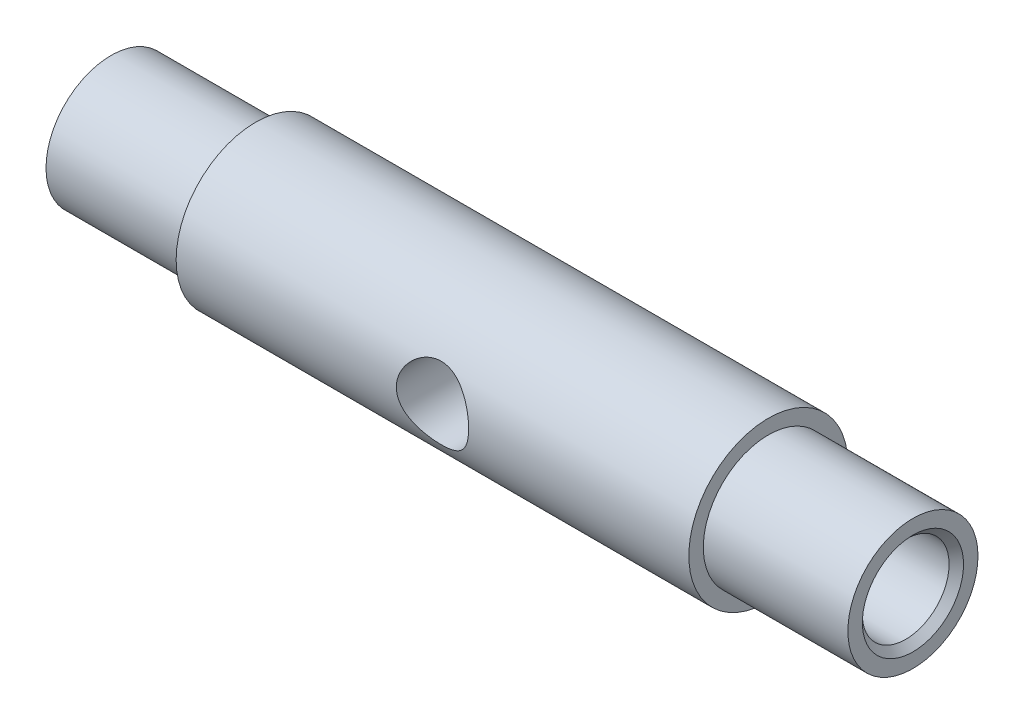
ISO-10303-21;
HEADER;
FILE_DESCRIPTION(('STEP AP214'),'2;1');
FILE_NAME('part.step','',(''),(''),'','','');
FILE_SCHEMA(('AUTOMOTIVE_DESIGN { 1 0 10303 214 1 1 1 1 }'));
ENDSEC;
DATA;
#1=APPLICATION_CONTEXT('core data for automotive mechanical design processes');
#2=APPLICATION_PROTOCOL_DEFINITION('international standard','automotive_design',2000,#1);
#3=PRODUCT_CONTEXT('',#1,'mechanical');
#4=PRODUCT('Part','Part','',(#3));
#5=PRODUCT_RELATED_PRODUCT_CATEGORY('part','',(#4));
#6=PRODUCT_DEFINITION_FORMATION('','',#4);
#7=PRODUCT_DEFINITION_CONTEXT('part definition',#1,'design');
#8=PRODUCT_DEFINITION('design','',#6,#7);
#9=PRODUCT_DEFINITION_SHAPE('','',#8);
#10=(LENGTH_UNIT() NAMED_UNIT(*) SI_UNIT(.MILLI.,.METRE.));
#11=(NAMED_UNIT(*) PLANE_ANGLE_UNIT() SI_UNIT($,.RADIAN.));
#12=(NAMED_UNIT(*) SI_UNIT($,.STERADIAN.) SOLID_ANGLE_UNIT());
#13=UNCERTAINTY_MEASURE_WITH_UNIT(LENGTH_MEASURE(1.E-05),#10,'distance_accuracy_value','');
#14=(GEOMETRIC_REPRESENTATION_CONTEXT(3) GLOBAL_UNCERTAINTY_ASSIGNED_CONTEXT((#13)) GLOBAL_UNIT_ASSIGNED_CONTEXT((#10,
#11,#12)) REPRESENTATION_CONTEXT('',''));
#15=CARTESIAN_POINT('',(0.,0.,0.));
#16=DIRECTION('',(0.,0.,1.));
#17=DIRECTION('',(1.,0.,0.));
#18=AXIS2_PLACEMENT_3D('',#15,#16,#17);
#19=CARTESIAN_POINT('',(-13.865,0.,0.));
#20=DIRECTION('',(1.,0.,0.));
#21=DIRECTION('',(0.,0.,-1.));
#22=AXIS2_PLACEMENT_3D('',#19,#20,#21);
#23=CYLINDRICAL_SURFACE('',#22,2.75);
#24=CARTESIAN_POINT('',(-1.25,0.,2.75));
#25=CARTESIAN_POINT('',(-1.24999664423867,-0.066409297201123,2.74999722006381));
#26=CARTESIAN_POINT('',(-1.24467658918359,-0.132918179160474,2.74756773000003));
#27=CARTESIAN_POINT('',(-1.22361132332389,-0.264013618832331,2.73809041057661));
#28=CARTESIAN_POINT('',(-1.20784192650701,-0.328595352707354,2.73103186721671));
#29=CARTESIAN_POINT('',(-1.16659731207724,-0.453733457531664,2.71304396647087));
#30=CARTESIAN_POINT('',(-1.1411573277518,-0.514303514696179,2.70212867062397));
#31=CARTESIAN_POINT('',(-1.08145528075543,-0.63024582495532,2.67746302459246));
#32=CARTESIAN_POINT('',(-1.04719498708065,-0.68561911727493,2.66371324300075));
#33=CARTESIAN_POINT('',(-0.968757040396112,-0.792876404622121,2.63383894536601));
#34=CARTESIAN_POINT('',(-0.924152661937973,-0.844423861031633,2.61762758087896));
#35=CARTESIAN_POINT('',(-0.827200544196096,-0.939605833782935,2.58499080357135));
#36=CARTESIAN_POINT('',(-0.774848012192131,-0.983235414967038,2.56856526404589));
#37=CARTESIAN_POINT('',(-0.660027529152778,-1.0639942192231,2.53622246241453));
#38=CARTESIAN_POINT('',(-0.597137096532528,-1.10056379760175,2.52039748982969));
#39=CARTESIAN_POINT('',(-0.465283990348065,-1.16245662732703,2.49245983364399));
#40=CARTESIAN_POINT('',(-0.396325044113193,-1.1877867250721,2.48034489151889));
#41=CARTESIAN_POINT('',(-0.258152257197776,-1.22502813882896,2.46215702137186));
#42=CARTESIAN_POINT('',(-0.189154209636334,-1.23759151471749,2.45579257210869));
#43=CARTESIAN_POINT('',(-0.0497590272881938,-1.25096639629459,2.44900910731335));
#44=CARTESIAN_POINT('',(0.0206370690327838,-1.25178632043297,2.4485858327753));
#45=CARTESIAN_POINT('',(0.153705360130787,-1.24213570599715,2.45349076513661));
#46=CARTESIAN_POINT('',(0.216478664779185,-1.23272508141617,2.45827909061313));
#47=CARTESIAN_POINT('',(0.339433038254887,-1.20468382543912,2.47214054978987));
#48=CARTESIAN_POINT('',(0.399613484659595,-1.18605099348516,2.48121470613037));
#49=CARTESIAN_POINT('',(0.51731828994404,-1.13972592389796,2.502836041094));
#50=CARTESIAN_POINT('',(0.57475099300539,-1.11183710259723,2.51545758142744));
#51=CARTESIAN_POINT('',(0.684370727634119,-1.0479342963697,2.5427424445358));
#52=CARTESIAN_POINT('',(0.736555495087547,-1.01191682605958,2.55740664212108));
#53=CARTESIAN_POINT('',(0.839823282611981,-0.928462390288526,2.58894610793606));
#54=CARTESIAN_POINT('',(0.890246366767324,-0.880233766499683,2.6058940299158));
#55=CARTESIAN_POINT('',(0.982534136643408,-0.775874076245868,2.63884684198751));
#56=CARTESIAN_POINT('',(1.02439599619325,-0.719740410517154,2.65485141943222));
#57=CARTESIAN_POINT('',(1.09960334197981,-0.598831409627828,2.68475267309383));
#58=CARTESIAN_POINT('',(1.13263123951186,-0.533836033425862,2.69856489262048));
#59=CARTESIAN_POINT('',(1.18704419793949,-0.398422448040728,2.72184968026242));
#60=CARTESIAN_POINT('',(1.2084369380899,-0.328007850689103,2.73132511002178));
#61=CARTESIAN_POINT('',(1.23747768468173,-0.189224957177744,2.74430245200301));
#62=CARTESIAN_POINT('',(1.24600819960431,-0.121077242101445,2.74818697383875));
#63=CARTESIAN_POINT('',(1.25177344223046,0.0157830218141219,2.75080503667139));
#64=CARTESIAN_POINT('',(1.24901224677108,0.0844953578580984,2.74954043674346));
#65=CARTESIAN_POINT('',(1.23285709547855,0.216073389246547,2.74224203969368));
#66=CARTESIAN_POINT('',(1.22012623923028,0.279039063698162,2.73650576628531));
#67=CARTESIAN_POINT('',(1.18536633693719,0.401846731740723,2.72118555280463));
#68=CARTESIAN_POINT('',(1.16333617942209,0.461688350977593,2.71160115280357));
#69=CARTESIAN_POINT('',(1.10991512595896,0.578663737582029,2.68910907975177));
#70=CARTESIAN_POINT('',(1.07825503256185,0.635655904758833,2.67610753251244));
#71=CARTESIAN_POINT('',(1.00676622266693,0.743723074643527,2.64811200049283));
#72=CARTESIAN_POINT('',(0.966933924043203,0.794795467118611,2.6331171430023));
#73=CARTESIAN_POINT('',(0.876344673437788,0.894095643067372,2.60116069331972));
#74=CARTESIAN_POINT('',(0.824951554626256,0.94172531826107,2.58413964097087));
#75=CARTESIAN_POINT('',(0.714718816878852,1.02789777986372,2.55109013589481));
#76=CARTESIAN_POINT('',(0.655876173523583,1.06643685729908,2.53506209027515));
#77=CARTESIAN_POINT('',(0.530272915587283,1.13425708875271,2.5054683792703));
#78=CARTESIAN_POINT('',(0.463339627914695,1.16325589057755,2.49198214330476));
#79=CARTESIAN_POINT('',(0.324725293272233,1.20928572229315,2.46997777901049));
#80=CARTESIAN_POINT('',(0.253049252960886,1.22632915900213,2.46145450187975));
#81=CARTESIAN_POINT('',(0.113718690216077,1.2466290380409,2.45123100377802));
#82=CARTESIAN_POINT('',(0.0462595388900316,1.25095942837577,2.44899997173237));
#83=CARTESIAN_POINT('',(-0.0884165459261601,1.24868510401172,2.45016089632338));
#84=CARTESIAN_POINT('',(-0.155633533948322,1.24208302836414,2.45355149592204));
#85=CARTESIAN_POINT('',(-0.283313147404379,1.21908425290037,2.46505170930849));
#86=CARTESIAN_POINT('',(-0.343929306975639,1.20335999852459,2.47283643484033));
#87=CARTESIAN_POINT('',(-0.461646409538555,1.16329328542381,2.49193468099743));
#88=CARTESIAN_POINT('',(-0.518746317999274,1.13894830444563,2.50324923426469));
#89=CARTESIAN_POINT('',(-0.631893509980613,1.08052106704645,2.52904242136797));
#90=CARTESIAN_POINT('',(-0.68762952189941,1.04590750399576,2.54367923604935));
#91=CARTESIAN_POINT('',(-0.792834391307874,0.968596555260978,2.57411065746893));
#92=CARTESIAN_POINT('',(-0.842300468195849,0.925895603760462,2.58990577302476));
#93=CARTESIAN_POINT('',(-0.938329950721095,0.828924012690176,2.62263949427761));
#94=CARTESIAN_POINT('',(-0.984193118870729,0.773945978687972,2.6395474679947));
#95=CARTESIAN_POINT('',(-1.06613132879772,0.656497888375395,2.6711803863168));
#96=CARTESIAN_POINT('',(-1.10220183612246,0.594024380555975,2.68590431818336));
#97=CARTESIAN_POINT('',(-1.16300847719161,0.463719738066244,2.71142629318597));
#98=CARTESIAN_POINT('',(-1.1878416325161,0.395940632153449,2.72225776873055));
#99=CARTESIAN_POINT('',(-1.2254803936225,0.256651849448491,2.73888892791797));
#100=CARTESIAN_POINT('',(-1.23832229651404,0.185154127024114,2.7447037925775));
#101=CARTESIAN_POINT('',(-1.24658170071688,0.0943030237739493,2.74844792420964));
#102=CARTESIAN_POINT('',(-1.24786228311144,0.0754723356989378,2.74902888293267));
#103=CARTESIAN_POINT('',(-1.24957191648039,0.0377637835624768,2.74980531908613));
#104=CARTESIAN_POINT('',(-1.25000095433378,0.0188859187785947,2.75000079057679));
#105=CARTESIAN_POINT('',(-1.25,0.,2.75));
#106=B_SPLINE_CURVE_WITH_KNOTS('',3,(#24,#25,#26,#27,#28,#29,#30,#31,#32,#33,#34,#35,#36,#37,
#38,#39,#40,#41,#42,#43,#44,#45,#46,#47,#48,#49,#50,#51,#52,#53,#54,#55,#56,#57,#58,#59,#60,#61,
#62,#63,#64,#65,#66,#67,#68,#69,#70,#71,#72,#73,#74,#75,#76,#77,#78,#79,#80,#81,#82,#83,#84,#85,
#86,#87,#88,#89,#90,#91,#92,#93,#94,#95,#96,#97,#98,#99,#100,#101,#102,#103,#104,#105),
.UNSPECIFIED.,.T.,.F.,(4,2,2,2,2,2,2,2,2,2,2,2,2,2,2,2,2,2,2,2,2,2,2,2,2,2,2,2,2,2,2,2,2,2,2,2,
2,2,2,2,4),(0.,0.199150465500601,0.398763501700331,0.597656142874561,0.79650892528868,
1.00581702909932,1.21525514848388,1.43748275689135,1.65957481148718,1.86964669042411,
2.07956796899307,2.26964626889944,2.45976994623912,2.65422185099479,2.8487572913309,
3.06321184122665,3.27773707147317,3.49916919969502,3.72045500384428,3.92572957947018,
4.13093004789081,4.32353422798305,4.51616143501641,4.71476455610418,4.91345491768045,
5.12881429156235,5.34426138090047,5.56560701120833,5.78672259633828,5.98852995638714,
6.19028860808863,6.37878337463006,6.56733333662171,6.76817468068634,6.96910478488007,
7.18876214345762,7.40852104069106,7.62634457271381,7.84350660241823,7.90014146715376,
7.95677720453813),.UNSPECIFIED.);
#107=CARTESIAN_POINT('',(-1.25,0.,2.75));
#108=VERTEX_POINT('',#107);
#109=EDGE_CURVE('E87',#108,#108,#106,.T.);
#110=ORIENTED_EDGE('',*,*,#109,.F.);
#111=EDGE_LOOP('',(#110));
#112=FACE_BOUND('',#111,.T.);
#113=DIRECTION('',(1.,0.,0.));
#114=VECTOR('',#113,1.);
#115=CARTESIAN_POINT('',(-13.865,-1.44461067419565,-2.34));
#116=LINE('',#115,#114);
#117=CARTESIAN_POINT('',(3.7,-1.44461067419565,-2.34));
#118=VERTEX_POINT('',#117);
#119=CARTESIAN_POINT('',(-3.7,-1.44461067419565,-2.34));
#120=VERTEX_POINT('',#119);
#121=EDGE_CURVE('E11',#118,#120,#116,.F.);
#122=ORIENTED_EDGE('',*,*,#121,.F.);
#123=CARTESIAN_POINT('',(3.7,0.,0.));
#124=DIRECTION('',(-1.,0.,0.));
#125=DIRECTION('',(0.,0.,1.));
#126=AXIS2_PLACEMENT_3D('',#123,#124,#125);
#127=CIRCLE('',#126,2.75);
#128=CARTESIAN_POINT('',(3.7,1.44461067419565,-2.34));
#129=VERTEX_POINT('',#128);
#130=EDGE_CURVE('E53',#118,#129,#127,.F.);
#131=ORIENTED_EDGE('',*,*,#130,.T.);
#132=DIRECTION('',(1.,0.,0.));
#133=VECTOR('',#132,1.);
#134=CARTESIAN_POINT('',(-13.865,1.44461067419565,-2.34));
#135=LINE('',#134,#133);
#136=CARTESIAN_POINT('',(-3.7,1.44461067419565,-2.34));
#137=VERTEX_POINT('',#136);
#138=EDGE_CURVE('E88',#137,#129,#135,.T.);
#139=ORIENTED_EDGE('',*,*,#138,.F.);
#140=CARTESIAN_POINT('',(-3.7,0.,0.));
#141=DIRECTION('',(1.,0.,0.));
#142=DIRECTION('',(0.,0.,-1.));
#143=AXIS2_PLACEMENT_3D('',#140,#141,#142);
#144=CIRCLE('',#143,2.75);
#145=EDGE_CURVE('E81',#137,#120,#144,.F.);
#146=ORIENTED_EDGE('',*,*,#145,.T.);
#147=EDGE_LOOP('',(#122,#131,#139,#146));
#148=FACE_BOUND('',#147,.T.);
#149=CARTESIAN_POINT('',(8.865,0.,0.));
#150=DIRECTION('',(1.,0.,0.));
#151=DIRECTION('',(0.,0.,-1.));
#152=AXIS2_PLACEMENT_3D('',#149,#150,#151);
#153=CIRCLE('',#152,2.75);
#154=CARTESIAN_POINT('',(8.865,0.,-2.75));
#155=VERTEX_POINT('',#154);
#156=EDGE_CURVE('E98',#155,#155,#153,.T.);
#157=ORIENTED_EDGE('',*,*,#156,.F.);
#158=EDGE_LOOP('',(#157));
#159=FACE_BOUND('',#158,.T.);
#160=CARTESIAN_POINT('',(-8.865,0.,0.));
#161=DIRECTION('',(-1.,0.,0.));
#162=DIRECTION('',(0.,0.,1.));
#163=AXIS2_PLACEMENT_3D('',#160,#161,#162);
#164=CIRCLE('',#163,2.75);
#165=CARTESIAN_POINT('',(-8.865,0.,2.75));
#166=VERTEX_POINT('',#165);
#167=EDGE_CURVE('E110',#166,#166,#164,.T.);
#168=ORIENTED_EDGE('',*,*,#167,.F.);
#169=EDGE_LOOP('',(#168));
#170=FACE_BOUND('',#169,.T.);
#171=ADVANCED_FACE('F44',(#112,#148,#159,#170),#23,.T.);
#172=CARTESIAN_POINT('',(8.865,0.,0.));
#173=DIRECTION('',(1.,0.,0.));
#174=DIRECTION('',(0.,0.,-1.));
#175=AXIS2_PLACEMENT_3D('',#172,#173,#174);
#176=PLANE('',#175);
#177=CARTESIAN_POINT('',(8.865,0.,0.));
#178=DIRECTION('',(1.,0.,0.));
#179=DIRECTION('',(0.,0.,-1.));
#180=AXIS2_PLACEMENT_3D('',#177,#178,#179);
#181=CIRCLE('',#180,2.25);
#182=CARTESIAN_POINT('',(8.865,0.,-2.25));
#183=VERTEX_POINT('',#182);
#184=EDGE_CURVE('E105',#183,#183,#181,.T.);
#185=ORIENTED_EDGE('',*,*,#184,.F.);
#186=EDGE_LOOP('',(#185));
#187=FACE_BOUND('',#186,.T.);
#188=ORIENTED_EDGE('',*,*,#156,.T.);
#189=EDGE_LOOP('',(#188));
#190=FACE_BOUND('',#189,.T.);
#191=ADVANCED_FACE('F204',(#187,#190),#176,.T.);
#192=CARTESIAN_POINT('',(8.865,0.,0.));
#193=DIRECTION('',(1.,0.,0.));
#194=DIRECTION('',(0.,0.,-1.));
#195=AXIS2_PLACEMENT_3D('',#192,#193,#194);
#196=CYLINDRICAL_SURFACE('',#195,2.25);
#197=ORIENTED_EDGE('',*,*,#184,.T.);
#198=EDGE_LOOP('',(#197));
#199=FACE_BOUND('',#198,.T.);
#200=CARTESIAN_POINT('',(13.865,0.,0.));
#201=DIRECTION('',(1.,0.,0.));
#202=DIRECTION('',(0.,0.,-1.));
#203=AXIS2_PLACEMENT_3D('',#200,#201,#202);
#204=CIRCLE('',#203,2.25);
#205=CARTESIAN_POINT('',(13.865,0.,-2.25));
#206=VERTEX_POINT('',#205);
#207=EDGE_CURVE('E101',#206,#206,#204,.T.);
#208=ORIENTED_EDGE('',*,*,#207,.F.);
#209=EDGE_LOOP('',(#208));
#210=FACE_BOUND('',#209,.T.);
#211=ADVANCED_FACE('F205',(#199,#210),#196,.T.);
#212=CARTESIAN_POINT('',(13.865,0.,0.));
#213=DIRECTION('',(1.,0.,0.));
#214=DIRECTION('',(0.,0.,-1.));
#215=AXIS2_PLACEMENT_3D('',#212,#213,#214);
#216=PLANE('',#215);
#217=CARTESIAN_POINT('',(13.865,0.,0.));
#218=DIRECTION('',(1.,0.,0.));
#219=DIRECTION('',(0.,0.,-1.));
#220=AXIS2_PLACEMENT_3D('',#217,#218,#219);
#221=CIRCLE('',#220,1.75);
#222=CARTESIAN_POINT('',(13.865,0.,-1.75));
#223=VERTEX_POINT('',#222);
#224=EDGE_CURVE('E145',#223,#223,#221,.T.);
#225=ORIENTED_EDGE('',*,*,#224,.F.);
#226=EDGE_LOOP('',(#225));
#227=FACE_BOUND('',#226,.T.);
#228=ORIENTED_EDGE('',*,*,#207,.T.);
#229=EDGE_LOOP('',(#228));
#230=FACE_BOUND('',#229,.T.);
#231=ADVANCED_FACE('F196',(#227,#230),#216,.T.);
#232=CARTESIAN_POINT('',(-8.865,0.,0.));
#233=DIRECTION('',(-1.,0.,0.));
#234=DIRECTION('',(0.,0.,1.));
#235=AXIS2_PLACEMENT_3D('',#232,#233,#234);
#236=PLANE('',#235);
#237=CARTESIAN_POINT('',(-8.865,0.,0.));
#238=DIRECTION('',(-1.,0.,0.));
#239=DIRECTION('',(0.,0.,1.));
#240=AXIS2_PLACEMENT_3D('',#237,#238,#239);
#241=CIRCLE('',#240,2.25);
#242=CARTESIAN_POINT('',(-8.865,0.,2.25));
#243=VERTEX_POINT('',#242);
#244=EDGE_CURVE('E112',#243,#243,#241,.T.);
#245=ORIENTED_EDGE('',*,*,#244,.F.);
#246=EDGE_LOOP('',(#245));
#247=FACE_BOUND('',#246,.T.);
#248=ORIENTED_EDGE('',*,*,#167,.T.);
#249=EDGE_LOOP('',(#248));
#250=FACE_BOUND('',#249,.T.);
#251=ADVANCED_FACE('F198',(#247,#250),#236,.T.);
#252=CARTESIAN_POINT('',(-8.865,0.,0.));
#253=DIRECTION('',(-1.,0.,0.));
#254=DIRECTION('',(0.,0.,1.));
#255=AXIS2_PLACEMENT_3D('',#252,#253,#254);
#256=CYLINDRICAL_SURFACE('',#255,2.25);
#257=ORIENTED_EDGE('',*,*,#244,.T.);
#258=EDGE_LOOP('',(#257));
#259=FACE_BOUND('',#258,.T.);
#260=CARTESIAN_POINT('',(-13.865,0.,0.));
#261=DIRECTION('',(-1.,0.,0.));
#262=DIRECTION('',(0.,0.,1.));
#263=AXIS2_PLACEMENT_3D('',#260,#261,#262);
#264=CIRCLE('',#263,2.25);
#265=CARTESIAN_POINT('',(-13.865,0.,2.25));
#266=VERTEX_POINT('',#265);
#267=EDGE_CURVE('E114',#266,#266,#264,.T.);
#268=ORIENTED_EDGE('',*,*,#267,.F.);
#269=EDGE_LOOP('',(#268));
#270=FACE_BOUND('',#269,.T.);
#271=ADVANCED_FACE('F194',(#259,#270),#256,.T.);
#272=CARTESIAN_POINT('',(-13.865,0.,0.));
#273=DIRECTION('',(1.,0.,0.));
#274=DIRECTION('',(0.,0.,-1.));
#275=AXIS2_PLACEMENT_3D('',#272,#273,#274);
#276=PLANE('',#275);
#277=CARTESIAN_POINT('',(-13.865,0.,0.));
#278=DIRECTION('',(-1.,0.,0.));
#279=DIRECTION('',(0.,0.,1.));
#280=AXIS2_PLACEMENT_3D('',#277,#278,#279);
#281=CIRCLE('',#280,1.75);
#282=CARTESIAN_POINT('',(-13.865,0.,1.75));
#283=VERTEX_POINT('',#282);
#284=EDGE_CURVE('E128',#283,#283,#281,.T.);
#285=ORIENTED_EDGE('',*,*,#284,.F.);
#286=EDGE_LOOP('',(#285));
#287=FACE_BOUND('',#286,.T.);
#288=ORIENTED_EDGE('',*,*,#267,.T.);
#289=EDGE_LOOP('',(#288));
#290=FACE_BOUND('',#289,.T.);
#291=ADVANCED_FACE('F195',(#287,#290),#276,.F.);
#292=CARTESIAN_POINT('',(-3.86500000000001,0.,0.));
#293=DIRECTION('',(-1.,0.,0.));
#294=DIRECTION('',(0.,0.,1.));
#295=AXIS2_PLACEMENT_3D('',#292,#293,#294);
#296=CONICAL_SURFACE('',#295,1.49999999999999,1.02974425867665);
#297=CARTESIAN_POINT('',(-2.96370907145866,0.,0.));
#298=VERTEX_POINT('',#297);
#299=VERTEX_LOOP('',#298);
#300=FACE_BOUND('',#299,.T.);
#301=CARTESIAN_POINT('',(-3.86500000000001,0.,0.));
#302=DIRECTION('',(-1.,0.,0.));
#303=DIRECTION('',(0.,0.,1.));
#304=AXIS2_PLACEMENT_3D('',#301,#302,#303);
#305=CIRCLE('',#304,1.49999999999999);
#306=CARTESIAN_POINT('',(-3.86500000000001,0.,1.49999999999999));
#307=VERTEX_POINT('',#306);
#308=EDGE_CURVE('E118',#307,#307,#305,.T.);
#309=ORIENTED_EDGE('',*,*,#308,.T.);
#310=EDGE_LOOP('',(#309));
#311=FACE_BOUND('',#310,.T.);
#312=ADVANCED_FACE('F189',(#300,#311),#296,.F.);
#313=CARTESIAN_POINT('',(-13.865,0.,0.));
#314=DIRECTION('',(-1.,0.,0.));
#315=DIRECTION('',(0.,0.,1.));
#316=AXIS2_PLACEMENT_3D('',#313,#314,#315);
#317=CYLINDRICAL_SURFACE('',#316,1.49999999999999);
#318=ORIENTED_EDGE('',*,*,#308,.F.);
#319=EDGE_LOOP('',(#318));
#320=FACE_BOUND('',#319,.T.);
#321=CARTESIAN_POINT('',(-13.615,0.,0.));
#322=DIRECTION('',(-1.,0.,0.));
#323=DIRECTION('',(0.,0.,1.));
#324=AXIS2_PLACEMENT_3D('',#321,#322,#323);
#325=CIRCLE('',#324,1.5);
#326=CARTESIAN_POINT('',(-13.615,0.,1.5));
#327=VERTEX_POINT('',#326);
#328=EDGE_CURVE('E127',#327,#327,#325,.T.);
#329=ORIENTED_EDGE('',*,*,#328,.T.);
#330=EDGE_LOOP('',(#329));
#331=FACE_BOUND('',#330,.T.);
#332=ADVANCED_FACE('F183',(#320,#331),#317,.F.);
#333=CARTESIAN_POINT('',(-13.865,0.,0.));
#334=DIRECTION('',(-1.,0.,0.));
#335=DIRECTION('',(0.,0.,1.));
#336=AXIS2_PLACEMENT_3D('',#333,#334,#335);
#337=CONICAL_SURFACE('',#336,1.75,0.785398163397447);
#338=ORIENTED_EDGE('',*,*,#328,.F.);
#339=EDGE_LOOP('',(#338));
#340=FACE_BOUND('',#339,.T.);
#341=ORIENTED_EDGE('',*,*,#284,.T.);
#342=EDGE_LOOP('',(#341));
#343=FACE_BOUND('',#342,.T.);
#344=ADVANCED_FACE('F179',(#340,#343),#337,.F.);
#345=CARTESIAN_POINT('',(3.86500000000001,0.,0.));
#346=DIRECTION('',(1.,0.,0.));
#347=DIRECTION('',(0.,0.,-1.));
#348=AXIS2_PLACEMENT_3D('',#345,#346,#347);
#349=CONICAL_SURFACE('',#348,1.49999999999999,1.02974425867665);
#350=CARTESIAN_POINT('',(2.96370907145867,0.,0.));
#351=VERTEX_POINT('',#350);
#352=VERTEX_LOOP('',#351);
#353=FACE_BOUND('',#352,.T.);
#354=CARTESIAN_POINT('',(3.86500000000001,0.,0.));
#355=DIRECTION('',(1.,0.,0.));
#356=DIRECTION('',(0.,0.,-1.));
#357=AXIS2_PLACEMENT_3D('',#354,#355,#356);
#358=CIRCLE('',#357,1.49999999999999);
#359=CARTESIAN_POINT('',(3.86500000000001,0.,-1.49999999999999));
#360=VERTEX_POINT('',#359);
#361=EDGE_CURVE('E135',#360,#360,#358,.T.);
#362=ORIENTED_EDGE('',*,*,#361,.T.);
#363=EDGE_LOOP('',(#362));
#364=FACE_BOUND('',#363,.T.);
#365=ADVANCED_FACE('F176',(#353,#364),#349,.F.);
#366=CARTESIAN_POINT('',(13.865,0.,0.));
#367=DIRECTION('',(1.,0.,0.));
#368=DIRECTION('',(0.,0.,-1.));
#369=AXIS2_PLACEMENT_3D('',#366,#367,#368);
#370=CYLINDRICAL_SURFACE('',#369,1.49999999999999);
#371=ORIENTED_EDGE('',*,*,#361,.F.);
#372=EDGE_LOOP('',(#371));
#373=FACE_BOUND('',#372,.T.);
#374=CARTESIAN_POINT('',(13.615,0.,0.));
#375=DIRECTION('',(1.,0.,0.));
#376=DIRECTION('',(0.,0.,-1.));
#377=AXIS2_PLACEMENT_3D('',#374,#375,#376);
#378=CIRCLE('',#377,1.49999999999999);
#379=CARTESIAN_POINT('',(13.615,0.,-1.49999999999999));
#380=VERTEX_POINT('',#379);
#381=EDGE_CURVE('E138',#380,#380,#378,.T.);
#382=ORIENTED_EDGE('',*,*,#381,.T.);
#383=EDGE_LOOP('',(#382));
#384=FACE_BOUND('',#383,.T.);
#385=ADVANCED_FACE('F175',(#373,#384),#370,.F.);
#386=CARTESIAN_POINT('',(13.865,0.,0.));
#387=DIRECTION('',(1.,0.,0.));
#388=DIRECTION('',(0.,0.,-1.));
#389=AXIS2_PLACEMENT_3D('',#386,#387,#388);
#390=CONICAL_SURFACE('',#389,1.75,0.785398163397438);
#391=ORIENTED_EDGE('',*,*,#381,.F.);
#392=EDGE_LOOP('',(#391));
#393=FACE_BOUND('',#392,.T.);
#394=ORIENTED_EDGE('',*,*,#224,.T.);
#395=EDGE_LOOP('',(#394));
#396=FACE_BOUND('',#395,.T.);
#397=ADVANCED_FACE('F169',(#393,#396),#390,.F.);
#398=CARTESIAN_POINT('',(3.7,-2.,-2.34));
#399=DIRECTION('',(-1.,0.,0.));
#400=DIRECTION('',(0.,0.,1.));
#401=AXIS2_PLACEMENT_3D('',#398,#399,#400);
#402=PLANE('',#401);
#403=DIRECTION('',(0.,1.,0.));
#404=VECTOR('',#403,1.);
#405=CARTESIAN_POINT('',(3.7,-2.,-2.34));
#406=LINE('',#405,#404);
#407=EDGE_CURVE('E79',#118,#129,#406,.T.);
#408=ORIENTED_EDGE('',*,*,#407,.T.);
#409=ORIENTED_EDGE('',*,*,#130,.F.);
#410=EDGE_LOOP('',(#408,#409));
#411=FACE_BOUND('',#410,.T.);
#412=ADVANCED_FACE('F76',(#411),#402,.T.);
#413=CARTESIAN_POINT('',(-3.7,-2.,-2.34));
#414=DIRECTION('',(1.,0.,0.));
#415=DIRECTION('',(0.,0.,-1.));
#416=AXIS2_PLACEMENT_3D('',#413,#414,#415);
#417=PLANE('',#416);
#418=DIRECTION('',(0.,-1.,0.));
#419=VECTOR('',#418,1.);
#420=CARTESIAN_POINT('',(-3.7,-2.,-2.34));
#421=LINE('',#420,#419);
#422=EDGE_CURVE('E58',#137,#120,#421,.T.);
#423=ORIENTED_EDGE('',*,*,#422,.T.);
#424=ORIENTED_EDGE('',*,*,#145,.F.);
#425=EDGE_LOOP('',(#423,#424));
#426=FACE_BOUND('',#425,.T.);
#427=ADVANCED_FACE('F161',(#426),#417,.T.);
#428=CARTESIAN_POINT('',(0.,0.,-2.34));
#429=DIRECTION('',(0.,0.,1.));
#430=DIRECTION('',(1.,0.,0.));
#431=AXIS2_PLACEMENT_3D('',#428,#429,#430);
#432=PLANE('',#431);
#433=CARTESIAN_POINT('',(0.,0.,-2.34));
#434=DIRECTION('',(0.,0.,-1.));
#435=DIRECTION('',(-1.,0.,0.));
#436=AXIS2_PLACEMENT_3D('',#433,#434,#435);
#437=CIRCLE('',#436,1.25);
#438=CARTESIAN_POINT('',(-1.25,0.,-2.34));
#439=VERTEX_POINT('',#438);
#440=EDGE_CURVE('E151',#439,#439,#437,.T.);
#441=ORIENTED_EDGE('',*,*,#440,.F.);
#442=EDGE_LOOP('',(#441));
#443=FACE_BOUND('',#442,.T.);
#444=ORIENTED_EDGE('',*,*,#121,.T.);
#445=ORIENTED_EDGE('',*,*,#422,.F.);
#446=ORIENTED_EDGE('',*,*,#138,.T.);
#447=ORIENTED_EDGE('',*,*,#407,.F.);
#448=EDGE_LOOP('',(#444,#445,#446,#447));
#449=FACE_BOUND('',#448,.T.);
#450=ADVANCED_FACE('F83',(#443,#449),#432,.F.);
#451=CARTESIAN_POINT('',(0.,0.,2.75));
#452=DIRECTION('',(0.,0.,-1.));
#453=DIRECTION('',(-1.,0.,0.));
#454=AXIS2_PLACEMENT_3D('',#451,#452,#453);
#455=CYLINDRICAL_SURFACE('',#454,1.25);
#456=ORIENTED_EDGE('',*,*,#109,.T.);
#457=EDGE_LOOP('',(#456));
#458=FACE_BOUND('',#457,.T.);
#459=ORIENTED_EDGE('',*,*,#440,.T.);
#460=EDGE_LOOP('',(#459));
#461=FACE_BOUND('',#460,.T.);
#462=ADVANCED_FACE('F156',(#458,#461),#455,.F.);
#463=CLOSED_SHELL('',(#171,#191,#211,#231,#251,#271,#291,#312,#332,#344,#365,#385,#397,#412,
#427,#450,#462));
#464=MANIFOLD_SOLID_BREP('B2',#463);
#465=ADVANCED_BREP_SHAPE_REPRESENTATION('',(#18,#464),#14);
#466=SHAPE_DEFINITION_REPRESENTATION(#9,#465);
ENDSEC;
END-ISO-10303-21;
